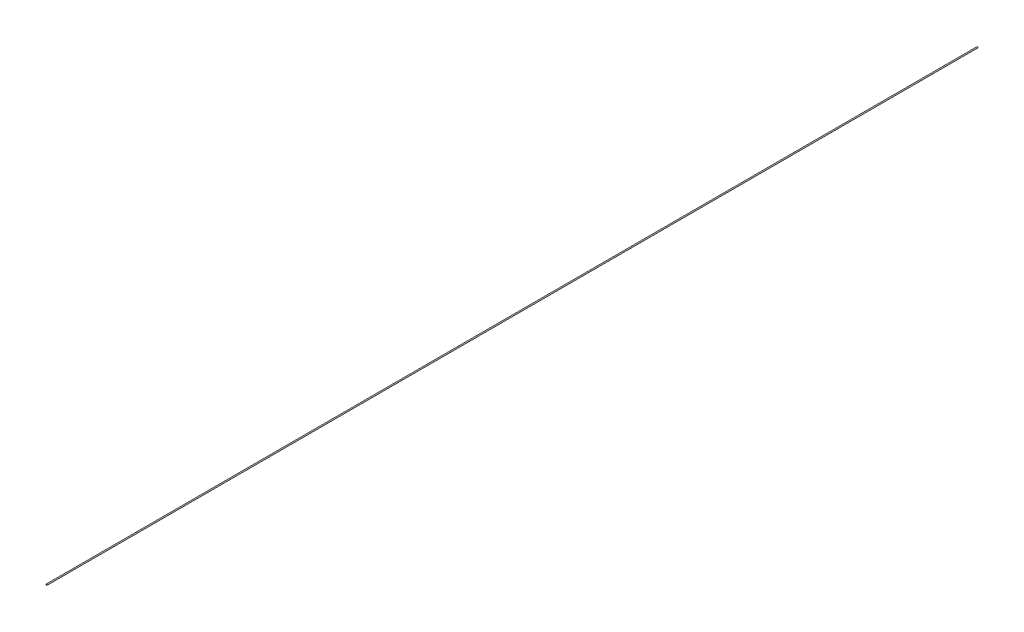
ISO-10303-21;
HEADER;
FILE_DESCRIPTION(('STEP AP214'),'2;1');
FILE_NAME('part.step','',(''),(''),'','','');
FILE_SCHEMA(('AUTOMOTIVE_DESIGN { 1 0 10303 214 1 1 1 1 }'));
ENDSEC;
DATA;
#1=APPLICATION_CONTEXT('core data for automotive mechanical design processes');
#2=APPLICATION_PROTOCOL_DEFINITION('international standard','automotive_design',2000,#1);
#3=PRODUCT_CONTEXT('',#1,'mechanical');
#4=PRODUCT('Part','Part','',(#3));
#5=PRODUCT_RELATED_PRODUCT_CATEGORY('part','',(#4));
#6=PRODUCT_DEFINITION_FORMATION('','',#4);
#7=PRODUCT_DEFINITION_CONTEXT('part definition',#1,'design');
#8=PRODUCT_DEFINITION('design','',#6,#7);
#9=PRODUCT_DEFINITION_SHAPE('','',#8);
#10=(LENGTH_UNIT() NAMED_UNIT(*) SI_UNIT(.MILLI.,.METRE.));
#11=(NAMED_UNIT(*) PLANE_ANGLE_UNIT() SI_UNIT($,.RADIAN.));
#12=(NAMED_UNIT(*) SI_UNIT($,.STERADIAN.) SOLID_ANGLE_UNIT());
#13=UNCERTAINTY_MEASURE_WITH_UNIT(LENGTH_MEASURE(1.E-05),#10,'distance_accuracy_value','');
#14=(GEOMETRIC_REPRESENTATION_CONTEXT(3) GLOBAL_UNCERTAINTY_ASSIGNED_CONTEXT((#13)) GLOBAL_UNIT_ASSIGNED_CONTEXT((#10,
#11,#12)) REPRESENTATION_CONTEXT('',''));
#15=CARTESIAN_POINT('',(0.,0.,0.));
#16=DIRECTION('',(0.,0.,1.));
#17=DIRECTION('',(1.,0.,0.));
#18=AXIS2_PLACEMENT_3D('',#15,#16,#17);
#19=CARTESIAN_POINT('',(0.,0.,1012.19));
#20=DIRECTION('',(0.,0.,-1.));
#21=DIRECTION('',(-1.,0.,0.));
#22=AXIS2_PLACEMENT_3D('',#19,#20,#21);
#23=CYLINDRICAL_SURFACE('',#22,0.6);
#24=CARTESIAN_POINT('',(0.,0.,1012.19));
#25=DIRECTION('',(0.,0.,1.));
#26=DIRECTION('',(1.,0.,0.));
#27=AXIS2_PLACEMENT_3D('',#24,#25,#26);
#28=CIRCLE('',#27,0.6);
#29=CARTESIAN_POINT('',(0.6,0.,1012.19));
#30=VERTEX_POINT('',#29);
#31=EDGE_CURVE('E10',#30,#30,#28,.T.);
#32=ORIENTED_EDGE('',*,*,#31,.F.);
#33=EDGE_LOOP('',(#32));
#34=FACE_BOUND('',#33,.T.);
#35=CARTESIAN_POINT('',(0.,0.,0.));
#36=DIRECTION('',(0.,0.,1.));
#37=DIRECTION('',(1.,0.,0.));
#38=AXIS2_PLACEMENT_3D('',#35,#36,#37);
#39=CIRCLE('',#38,0.6);
#40=CARTESIAN_POINT('',(0.6,0.,0.));
#41=VERTEX_POINT('',#40);
#42=EDGE_CURVE('E34',#41,#41,#39,.T.);
#43=ORIENTED_EDGE('',*,*,#42,.T.);
#44=EDGE_LOOP('',(#43));
#45=FACE_BOUND('',#44,.T.);
#46=ADVANCED_FACE('F31',(#34,#45),#23,.T.);
#47=CARTESIAN_POINT('',(0.,0.,1012.19));
#48=DIRECTION('',(0.,0.,1.));
#49=DIRECTION('',(1.,0.,0.));
#50=AXIS2_PLACEMENT_3D('',#47,#48,#49);
#51=PLANE('',#50);
#52=ORIENTED_EDGE('',*,*,#31,.T.);
#53=EDGE_LOOP('',(#52));
#54=FACE_BOUND('',#53,.T.);
#55=ADVANCED_FACE('F46',(#54),#51,.T.);
#56=CARTESIAN_POINT('',(0.,0.,0.));
#57=DIRECTION('',(0.,0.,1.));
#58=DIRECTION('',(1.,0.,0.));
#59=AXIS2_PLACEMENT_3D('',#56,#57,#58);
#60=PLANE('',#59);
#61=ORIENTED_EDGE('',*,*,#42,.F.);
#62=EDGE_LOOP('',(#61));
#63=FACE_BOUND('',#62,.T.);
#64=ADVANCED_FACE('F44',(#63),#60,.F.);
#65=CLOSED_SHELL('',(#46,#55,#64));
#66=MANIFOLD_SOLID_BREP('B2',#65);
#67=ADVANCED_BREP_SHAPE_REPRESENTATION('',(#18,#66),#14);
#68=SHAPE_DEFINITION_REPRESENTATION(#9,#67);
ENDSEC;
END-ISO-10303-21;
